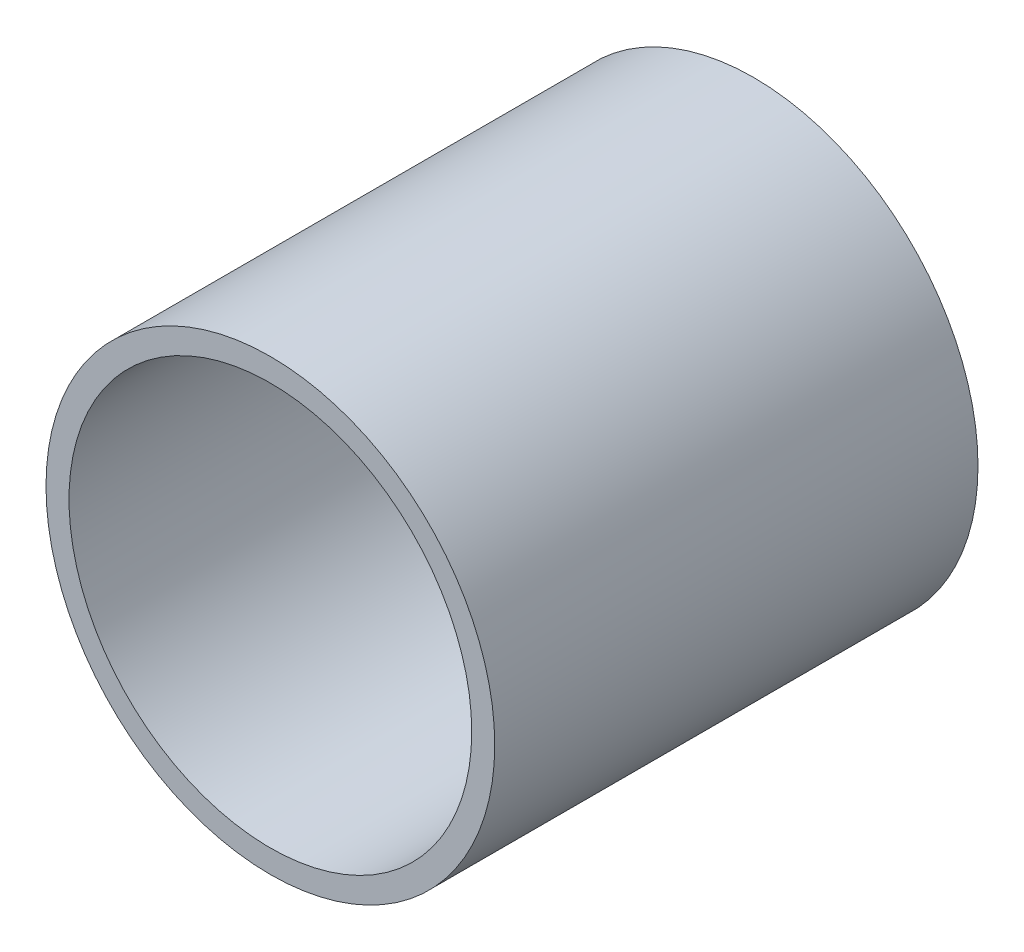
ISO-10303-21;
HEADER;
FILE_DESCRIPTION(('STEP AP214'),'2;1');
FILE_NAME('part.step','',(''),(''),'','','');
FILE_SCHEMA(('AUTOMOTIVE_DESIGN { 1 0 10303 214 1 1 1 1 }'));
ENDSEC;
DATA;
#1=APPLICATION_CONTEXT('core data for automotive mechanical design processes');
#2=APPLICATION_PROTOCOL_DEFINITION('international standard','automotive_design',2000,#1);
#3=PRODUCT_CONTEXT('',#1,'mechanical');
#4=PRODUCT('Part','Part','',(#3));
#5=PRODUCT_RELATED_PRODUCT_CATEGORY('part','',(#4));
#6=PRODUCT_DEFINITION_FORMATION('','',#4);
#7=PRODUCT_DEFINITION_CONTEXT('part definition',#1,'design');
#8=PRODUCT_DEFINITION('design','',#6,#7);
#9=PRODUCT_DEFINITION_SHAPE('','',#8);
#10=(LENGTH_UNIT() NAMED_UNIT(*) SI_UNIT(.MILLI.,.METRE.));
#11=(NAMED_UNIT(*) PLANE_ANGLE_UNIT() SI_UNIT($,.RADIAN.));
#12=(NAMED_UNIT(*) SI_UNIT($,.STERADIAN.) SOLID_ANGLE_UNIT());
#13=UNCERTAINTY_MEASURE_WITH_UNIT(LENGTH_MEASURE(1.E-05),#10,'distance_accuracy_value','');
#14=(GEOMETRIC_REPRESENTATION_CONTEXT(3) GLOBAL_UNCERTAINTY_ASSIGNED_CONTEXT((#13)) GLOBAL_UNIT_ASSIGNED_CONTEXT((#10,
#11,#12)) REPRESENTATION_CONTEXT('',''));
#15=CARTESIAN_POINT('',(0.,0.,0.));
#16=DIRECTION('',(0.,0.,1.));
#17=DIRECTION('',(1.,0.,0.));
#18=AXIS2_PLACEMENT_3D('',#15,#16,#17);
#19=CARTESIAN_POINT('',(0.,0.,4.2));
#20=DIRECTION('',(0.,0.,1.));
#21=DIRECTION('',(1.,0.,0.));
#22=AXIS2_PLACEMENT_3D('',#19,#20,#21);
#23=PLANE('',#22);
#24=CARTESIAN_POINT('',(0.,0.,4.2));
#25=DIRECTION('',(0.,0.,1.));
#26=DIRECTION('',(1.,0.,0.));
#27=AXIS2_PLACEMENT_3D('',#24,#25,#26);
#28=CIRCLE('',#27,1.95);
#29=CARTESIAN_POINT('',(1.95,0.,4.2));
#30=VERTEX_POINT('',#29);
#31=EDGE_CURVE('E10',#30,#30,#28,.T.);
#32=ORIENTED_EDGE('',*,*,#31,.T.);
#33=EDGE_LOOP('',(#32));
#34=FACE_BOUND('',#33,.T.);
#35=CARTESIAN_POINT('',(0.,0.,4.2));
#36=DIRECTION('',(0.,0.,1.));
#37=DIRECTION('',(1.,0.,0.));
#38=AXIS2_PLACEMENT_3D('',#35,#36,#37);
#39=CIRCLE('',#38,1.75);
#40=CARTESIAN_POINT('',(1.75,0.,4.2));
#41=VERTEX_POINT('',#40);
#42=EDGE_CURVE('E45',#41,#41,#39,.T.);
#43=ORIENTED_EDGE('',*,*,#42,.F.);
#44=EDGE_LOOP('',(#43));
#45=FACE_BOUND('',#44,.T.);
#46=ADVANCED_FACE('F34',(#34,#45),#23,.T.);
#47=CARTESIAN_POINT('',(0.,0.,0.));
#48=DIRECTION('',(0.,0.,1.));
#49=DIRECTION('',(1.,0.,0.));
#50=AXIS2_PLACEMENT_3D('',#47,#48,#49);
#51=PLANE('',#50);
#52=CARTESIAN_POINT('',(0.,0.,0.));
#53=DIRECTION('',(0.,0.,1.));
#54=DIRECTION('',(1.,0.,0.));
#55=AXIS2_PLACEMENT_3D('',#52,#53,#54);
#56=CIRCLE('',#55,1.95);
#57=CARTESIAN_POINT('',(1.95,0.,0.));
#58=VERTEX_POINT('',#57);
#59=EDGE_CURVE('E38',#58,#58,#56,.T.);
#60=ORIENTED_EDGE('',*,*,#59,.F.);
#61=EDGE_LOOP('',(#60));
#62=FACE_BOUND('',#61,.T.);
#63=CARTESIAN_POINT('',(0.,0.,0.));
#64=DIRECTION('',(0.,0.,1.));
#65=DIRECTION('',(1.,0.,0.));
#66=AXIS2_PLACEMENT_3D('',#63,#64,#65);
#67=CIRCLE('',#66,1.75);
#68=CARTESIAN_POINT('',(1.75,0.,0.));
#69=VERTEX_POINT('',#68);
#70=EDGE_CURVE('E47',#69,#69,#67,.T.);
#71=ORIENTED_EDGE('',*,*,#70,.T.);
#72=EDGE_LOOP('',(#71));
#73=FACE_BOUND('',#72,.T.);
#74=ADVANCED_FACE('F57',(#62,#73),#51,.F.);
#75=CARTESIAN_POINT('',(0.,0.,4.2));
#76=DIRECTION('',(0.,0.,-1.));
#77=DIRECTION('',(-1.,0.,0.));
#78=AXIS2_PLACEMENT_3D('',#75,#76,#77);
#79=CYLINDRICAL_SURFACE('',#78,1.95);
#80=ORIENTED_EDGE('',*,*,#31,.F.);
#81=EDGE_LOOP('',(#80));
#82=FACE_BOUND('',#81,.T.);
#83=ORIENTED_EDGE('',*,*,#59,.T.);
#84=EDGE_LOOP('',(#83));
#85=FACE_BOUND('',#84,.T.);
#86=ADVANCED_FACE('F36',(#82,#85),#79,.T.);
#87=CARTESIAN_POINT('',(0.,0.,4.2));
#88=DIRECTION('',(0.,0.,-1.));
#89=DIRECTION('',(-1.,0.,0.));
#90=AXIS2_PLACEMENT_3D('',#87,#88,#89);
#91=CYLINDRICAL_SURFACE('',#90,1.75);
#92=ORIENTED_EDGE('',*,*,#42,.T.);
#93=EDGE_LOOP('',(#92));
#94=FACE_BOUND('',#93,.T.);
#95=ORIENTED_EDGE('',*,*,#70,.F.);
#96=EDGE_LOOP('',(#95));
#97=FACE_BOUND('',#96,.T.);
#98=ADVANCED_FACE('F53',(#94,#97),#91,.F.);
#99=CLOSED_SHELL('',(#46,#74,#86,#98));
#100=MANIFOLD_SOLID_BREP('B2',#99);
#101=ADVANCED_BREP_SHAPE_REPRESENTATION('',(#18,#100),#14);
#102=SHAPE_DEFINITION_REPRESENTATION(#9,#101);
ENDSEC;
END-ISO-10303-21;
